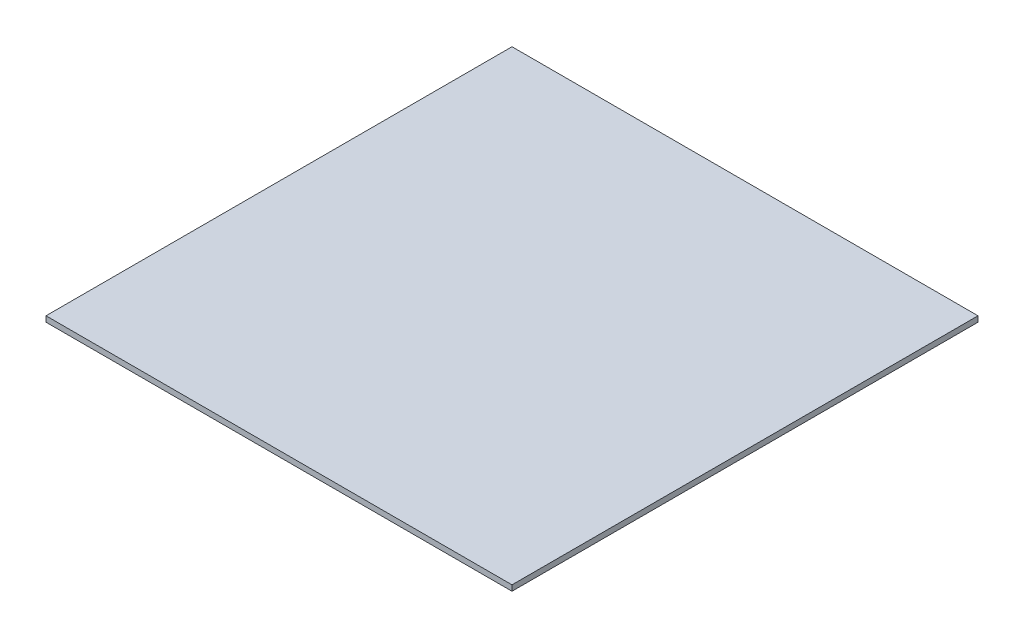
ISO-10303-21;
HEADER;
FILE_DESCRIPTION(('STEP AP214'),'2;1');
FILE_NAME('part.step','',(''),(''),'','','');
FILE_SCHEMA(('AUTOMOTIVE_DESIGN { 1 0 10303 214 1 1 1 1 }'));
ENDSEC;
DATA;
#1=APPLICATION_CONTEXT('core data for automotive mechanical design processes');
#2=APPLICATION_PROTOCOL_DEFINITION('international standard','automotive_design',2000,#1);
#3=PRODUCT_CONTEXT('',#1,'mechanical');
#4=PRODUCT('Part','Part','',(#3));
#5=PRODUCT_RELATED_PRODUCT_CATEGORY('part','',(#4));
#6=PRODUCT_DEFINITION_FORMATION('','',#4);
#7=PRODUCT_DEFINITION_CONTEXT('part definition',#1,'design');
#8=PRODUCT_DEFINITION('design','',#6,#7);
#9=PRODUCT_DEFINITION_SHAPE('','',#8);
#10=(LENGTH_UNIT() NAMED_UNIT(*) SI_UNIT(.MILLI.,.METRE.));
#11=(NAMED_UNIT(*) PLANE_ANGLE_UNIT() SI_UNIT($,.RADIAN.));
#12=(NAMED_UNIT(*) SI_UNIT($,.STERADIAN.) SOLID_ANGLE_UNIT());
#13=UNCERTAINTY_MEASURE_WITH_UNIT(LENGTH_MEASURE(1.E-05),#10,'distance_accuracy_value','');
#14=(GEOMETRIC_REPRESENTATION_CONTEXT(3) GLOBAL_UNCERTAINTY_ASSIGNED_CONTEXT((#13)) GLOBAL_UNIT_ASSIGNED_CONTEXT((#10,
#11,#12)) REPRESENTATION_CONTEXT('',''));
#15=CARTESIAN_POINT('',(0.,0.,0.));
#16=DIRECTION('',(0.,0.,1.));
#17=DIRECTION('',(1.,0.,0.));
#18=AXIS2_PLACEMENT_3D('',#15,#16,#17);
#19=CARTESIAN_POINT('',(0.,1.2,0.));
#20=DIRECTION('',(1.,0.,0.));
#21=DIRECTION('',(0.,0.,-1.));
#22=AXIS2_PLACEMENT_3D('',#19,#20,#21);
#23=PLANE('',#22);
#24=DIRECTION('',(0.,0.,1.));
#25=VECTOR('',#24,1.);
#26=CARTESIAN_POINT('',(0.,0.,0.));
#27=LINE('',#26,#25);
#28=CARTESIAN_POINT('',(0.,0.,-100.));
#29=VERTEX_POINT('',#28);
#30=CARTESIAN_POINT('',(0.,0.,0.));
#31=VERTEX_POINT('',#30);
#32=EDGE_CURVE('E97',#29,#31,#27,.T.);
#33=ORIENTED_EDGE('',*,*,#32,.T.);
#34=DIRECTION('',(0.,-1.,0.));
#35=VECTOR('',#34,1.);
#36=CARTESIAN_POINT('',(0.,1.2,0.));
#37=LINE('',#36,#35);
#38=CARTESIAN_POINT('',(0.,1.2,0.));
#39=VERTEX_POINT('',#38);
#40=EDGE_CURVE('E11',#39,#31,#37,.T.);
#41=ORIENTED_EDGE('',*,*,#40,.F.);
#42=DIRECTION('',(0.,0.,1.));
#43=VECTOR('',#42,1.);
#44=CARTESIAN_POINT('',(0.,1.2,0.));
#45=LINE('',#44,#43);
#46=CARTESIAN_POINT('',(0.,1.2,-100.));
#47=VERTEX_POINT('',#46);
#48=EDGE_CURVE('E85',#47,#39,#45,.T.);
#49=ORIENTED_EDGE('',*,*,#48,.F.);
#50=DIRECTION('',(0.,-1.,0.));
#51=VECTOR('',#50,1.);
#52=CARTESIAN_POINT('',(0.,1.2,-100.));
#53=LINE('',#52,#51);
#54=EDGE_CURVE('E93',#47,#29,#53,.T.);
#55=ORIENTED_EDGE('',*,*,#54,.T.);
#56=EDGE_LOOP('',(#33,#41,#49,#55));
#57=FACE_BOUND('',#56,.T.);
#58=ADVANCED_FACE('F34',(#57),#23,.F.);
#59=CARTESIAN_POINT('',(0.,1.2,0.));
#60=DIRECTION('',(0.,0.,-1.));
#61=DIRECTION('',(-1.,0.,0.));
#62=AXIS2_PLACEMENT_3D('',#59,#60,#61);
#63=PLANE('',#62);
#64=DIRECTION('',(1.,0.,0.));
#65=VECTOR('',#64,1.);
#66=CARTESIAN_POINT('',(0.,0.,0.));
#67=LINE('',#66,#65);
#68=CARTESIAN_POINT('',(100.,0.,0.));
#69=VERTEX_POINT('',#68);
#70=EDGE_CURVE('E89',#31,#69,#67,.T.);
#71=ORIENTED_EDGE('',*,*,#70,.T.);
#72=DIRECTION('',(0.,-1.,0.));
#73=VECTOR('',#72,1.);
#74=CARTESIAN_POINT('',(100.,1.2,0.));
#75=LINE('',#74,#73);
#76=CARTESIAN_POINT('',(100.,1.2,0.));
#77=VERTEX_POINT('',#76);
#78=EDGE_CURVE('E42',#77,#69,#75,.T.);
#79=ORIENTED_EDGE('',*,*,#78,.F.);
#80=DIRECTION('',(1.,0.,0.));
#81=VECTOR('',#80,1.);
#82=CARTESIAN_POINT('',(0.,1.2,0.));
#83=LINE('',#82,#81);
#84=EDGE_CURVE('E80',#39,#77,#83,.T.);
#85=ORIENTED_EDGE('',*,*,#84,.F.);
#86=ORIENTED_EDGE('',*,*,#40,.T.);
#87=EDGE_LOOP('',(#71,#79,#85,#86));
#88=FACE_BOUND('',#87,.T.);
#89=ADVANCED_FACE('F88',(#88),#63,.F.);
#90=CARTESIAN_POINT('',(100.,1.2,0.));
#91=DIRECTION('',(-1.,0.,0.));
#92=DIRECTION('',(0.,0.,1.));
#93=AXIS2_PLACEMENT_3D('',#90,#91,#92);
#94=PLANE('',#93);
#95=DIRECTION('',(0.,0.,-1.));
#96=VECTOR('',#95,1.);
#97=CARTESIAN_POINT('',(100.,0.,0.));
#98=LINE('',#97,#96);
#99=CARTESIAN_POINT('',(100.,0.,-100.));
#100=VERTEX_POINT('',#99);
#101=EDGE_CURVE('E67',#69,#100,#98,.T.);
#102=ORIENTED_EDGE('',*,*,#101,.T.);
#103=DIRECTION('',(0.,-1.,0.));
#104=VECTOR('',#103,1.);
#105=CARTESIAN_POINT('',(100.,1.2,-100.));
#106=LINE('',#105,#104);
#107=CARTESIAN_POINT('',(100.,1.2,-100.));
#108=VERTEX_POINT('',#107);
#109=EDGE_CURVE('E90',#108,#100,#106,.T.);
#110=ORIENTED_EDGE('',*,*,#109,.F.);
#111=DIRECTION('',(0.,0.,-1.));
#112=VECTOR('',#111,1.);
#113=CARTESIAN_POINT('',(100.,1.2,0.));
#114=LINE('',#113,#112);
#115=EDGE_CURVE('E83',#77,#108,#114,.T.);
#116=ORIENTED_EDGE('',*,*,#115,.F.);
#117=ORIENTED_EDGE('',*,*,#78,.T.);
#118=EDGE_LOOP('',(#102,#110,#116,#117));
#119=FACE_BOUND('',#118,.T.);
#120=ADVANCED_FACE('F91',(#119),#94,.F.);
#121=CARTESIAN_POINT('',(0.,1.2,-100.));
#122=DIRECTION('',(0.,0.,1.));
#123=DIRECTION('',(1.,0.,0.));
#124=AXIS2_PLACEMENT_3D('',#121,#122,#123);
#125=PLANE('',#124);
#126=DIRECTION('',(-1.,0.,0.));
#127=VECTOR('',#126,1.);
#128=CARTESIAN_POINT('',(0.,0.,-100.));
#129=LINE('',#128,#127);
#130=EDGE_CURVE('E73',#100,#29,#129,.T.);
#131=ORIENTED_EDGE('',*,*,#130,.T.);
#132=ORIENTED_EDGE('',*,*,#54,.F.);
#133=DIRECTION('',(-1.,0.,0.));
#134=VECTOR('',#133,1.);
#135=CARTESIAN_POINT('',(0.,1.2,-100.));
#136=LINE('',#135,#134);
#137=EDGE_CURVE('E50',#108,#47,#136,.T.);
#138=ORIENTED_EDGE('',*,*,#137,.F.);
#139=ORIENTED_EDGE('',*,*,#109,.T.);
#140=EDGE_LOOP('',(#131,#132,#138,#139));
#141=FACE_BOUND('',#140,.T.);
#142=ADVANCED_FACE('F104',(#141),#125,.F.);
#143=CARTESIAN_POINT('',(0.,1.2,0.));
#144=DIRECTION('',(0.,-1.,0.));
#145=DIRECTION('',(0.,0.,-1.));
#146=AXIS2_PLACEMENT_3D('',#143,#144,#145);
#147=PLANE('',#146);
#148=ORIENTED_EDGE('',*,*,#48,.T.);
#149=ORIENTED_EDGE('',*,*,#84,.T.);
#150=ORIENTED_EDGE('',*,*,#115,.T.);
#151=ORIENTED_EDGE('',*,*,#137,.T.);
#152=EDGE_LOOP('',(#148,#149,#150,#151));
#153=FACE_BOUND('',#152,.T.);
#154=ADVANCED_FACE('F81',(#153),#147,.F.);
#155=CARTESIAN_POINT('',(0.,0.,0.));
#156=DIRECTION('',(0.,-1.,0.));
#157=DIRECTION('',(0.,0.,-1.));
#158=AXIS2_PLACEMENT_3D('',#155,#156,#157);
#159=PLANE('',#158);
#160=ORIENTED_EDGE('',*,*,#32,.F.);
#161=ORIENTED_EDGE('',*,*,#130,.F.);
#162=ORIENTED_EDGE('',*,*,#101,.F.);
#163=ORIENTED_EDGE('',*,*,#70,.F.);
#164=EDGE_LOOP('',(#160,#161,#162,#163));
#165=FACE_BOUND('',#164,.T.);
#166=ADVANCED_FACE('F107',(#165),#159,.T.);
#167=CLOSED_SHELL('',(#58,#89,#120,#142,#154,#166));
#168=MANIFOLD_SOLID_BREP('B2',#167);
#169=ADVANCED_BREP_SHAPE_REPRESENTATION('',(#18,#168),#14);
#170=SHAPE_DEFINITION_REPRESENTATION(#9,#169);
ENDSEC;
END-ISO-10303-21;
